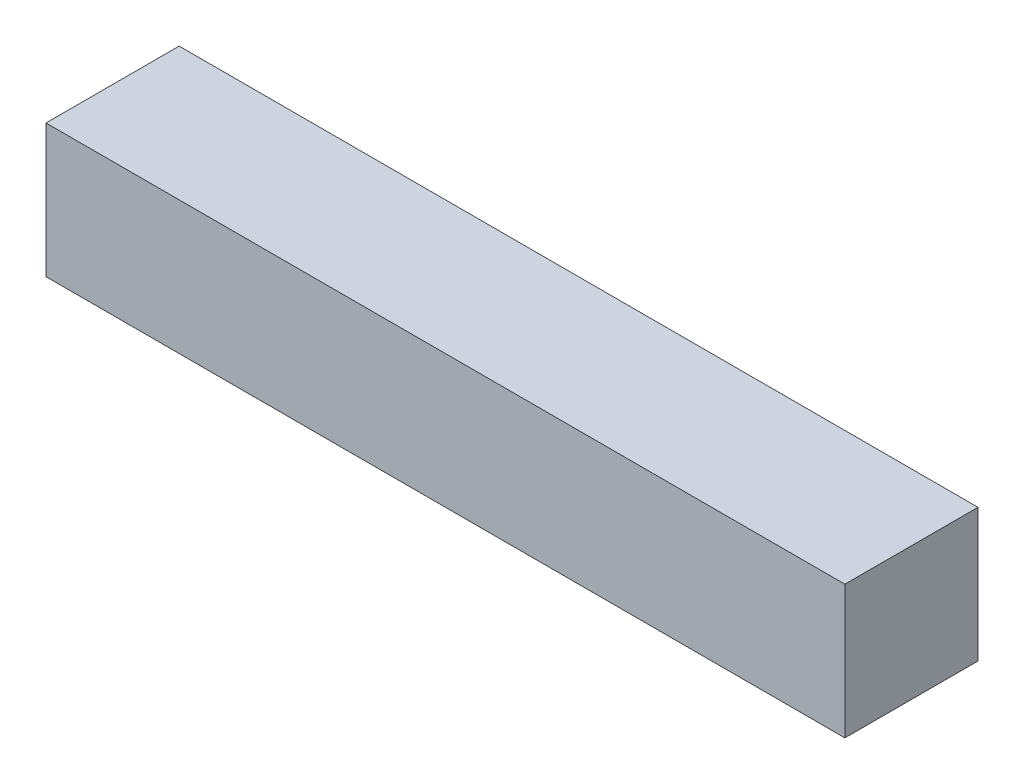
ISO-10303-21;
HEADER;
FILE_DESCRIPTION(('STEP AP214'),'2;1');
FILE_NAME('part.step','',(''),(''),'','','');
FILE_SCHEMA(('AUTOMOTIVE_DESIGN { 1 0 10303 214 1 1 1 1 }'));
ENDSEC;
DATA;
#1=APPLICATION_CONTEXT('core data for automotive mechanical design processes');
#2=APPLICATION_PROTOCOL_DEFINITION('international standard','automotive_design',2000,#1);
#3=PRODUCT_CONTEXT('',#1,'mechanical');
#4=PRODUCT('Part','Part','',(#3));
#5=PRODUCT_RELATED_PRODUCT_CATEGORY('part','',(#4));
#6=PRODUCT_DEFINITION_FORMATION('','',#4);
#7=PRODUCT_DEFINITION_CONTEXT('part definition',#1,'design');
#8=PRODUCT_DEFINITION('design','',#6,#7);
#9=PRODUCT_DEFINITION_SHAPE('','',#8);
#10=(LENGTH_UNIT() NAMED_UNIT(*) SI_UNIT(.MILLI.,.METRE.));
#11=(NAMED_UNIT(*) PLANE_ANGLE_UNIT() SI_UNIT($,.RADIAN.));
#12=(NAMED_UNIT(*) SI_UNIT($,.STERADIAN.) SOLID_ANGLE_UNIT());
#13=UNCERTAINTY_MEASURE_WITH_UNIT(LENGTH_MEASURE(1.E-05),#10,'distance_accuracy_value','');
#14=(GEOMETRIC_REPRESENTATION_CONTEXT(3) GLOBAL_UNCERTAINTY_ASSIGNED_CONTEXT((#13)) GLOBAL_UNIT_ASSIGNED_CONTEXT((#10,
#11,#12)) REPRESENTATION_CONTEXT('',''));
#15=CARTESIAN_POINT('',(0.,0.,0.));
#16=DIRECTION('',(0.,0.,1.));
#17=DIRECTION('',(1.,0.,0.));
#18=AXIS2_PLACEMENT_3D('',#15,#16,#17);
#19=CARTESIAN_POINT('',(19.05,-3.175,6.35));
#20=DIRECTION('',(-1.,0.,0.));
#21=DIRECTION('',(0.,0.,1.));
#22=AXIS2_PLACEMENT_3D('',#19,#20,#21);
#23=PLANE('',#22);
#24=DIRECTION('',(0.,1.,0.));
#25=VECTOR('',#24,1.);
#26=CARTESIAN_POINT('',(19.05,-3.175,0.));
#27=LINE('',#26,#25);
#28=CARTESIAN_POINT('',(19.05,-3.175,0.));
#29=VERTEX_POINT('',#28);
#30=CARTESIAN_POINT('',(19.05,3.175,0.));
#31=VERTEX_POINT('',#30);
#32=EDGE_CURVE('E96',#29,#31,#27,.T.);
#33=ORIENTED_EDGE('',*,*,#32,.T.);
#34=DIRECTION('',(0.,0.,-1.));
#35=VECTOR('',#34,1.);
#36=CARTESIAN_POINT('',(19.05,3.175,6.35));
#37=LINE('',#36,#35);
#38=CARTESIAN_POINT('',(19.05,3.175,6.35));
#39=VERTEX_POINT('',#38);
#40=EDGE_CURVE('E11',#39,#31,#37,.T.);
#41=ORIENTED_EDGE('',*,*,#40,.F.);
#42=DIRECTION('',(0.,1.,0.));
#43=VECTOR('',#42,1.);
#44=CARTESIAN_POINT('',(19.05,-3.175,6.35));
#45=LINE('',#44,#43);
#46=CARTESIAN_POINT('',(19.05,-3.175,6.35));
#47=VERTEX_POINT('',#46);
#48=EDGE_CURVE('E84',#47,#39,#45,.T.);
#49=ORIENTED_EDGE('',*,*,#48,.F.);
#50=DIRECTION('',(0.,0.,-1.));
#51=VECTOR('',#50,1.);
#52=CARTESIAN_POINT('',(19.05,-3.175,6.35));
#53=LINE('',#52,#51);
#54=EDGE_CURVE('E92',#47,#29,#53,.T.);
#55=ORIENTED_EDGE('',*,*,#54,.T.);
#56=EDGE_LOOP('',(#33,#41,#49,#55));
#57=FACE_BOUND('',#56,.T.);
#58=ADVANCED_FACE('F33',(#57),#23,.F.);
#59=CARTESIAN_POINT('',(-19.05,3.175,6.35));
#60=DIRECTION('',(0.,-1.,0.));
#61=DIRECTION('',(0.,0.,-1.));
#62=AXIS2_PLACEMENT_3D('',#59,#60,#61);
#63=PLANE('',#62);
#64=DIRECTION('',(-1.,0.,0.));
#65=VECTOR('',#64,1.);
#66=CARTESIAN_POINT('',(-19.05,3.175,0.));
#67=LINE('',#66,#65);
#68=CARTESIAN_POINT('',(-19.05,3.175,0.));
#69=VERTEX_POINT('',#68);
#70=EDGE_CURVE('E88',#31,#69,#67,.T.);
#71=ORIENTED_EDGE('',*,*,#70,.T.);
#72=DIRECTION('',(0.,0.,-1.));
#73=VECTOR('',#72,1.);
#74=CARTESIAN_POINT('',(-19.05,3.175,6.35));
#75=LINE('',#74,#73);
#76=CARTESIAN_POINT('',(-19.05,3.175,6.35));
#77=VERTEX_POINT('',#76);
#78=EDGE_CURVE('E41',#77,#69,#75,.T.);
#79=ORIENTED_EDGE('',*,*,#78,.F.);
#80=DIRECTION('',(-1.,0.,0.));
#81=VECTOR('',#80,1.);
#82=CARTESIAN_POINT('',(-19.05,3.175,6.35));
#83=LINE('',#82,#81);
#84=EDGE_CURVE('E79',#39,#77,#83,.T.);
#85=ORIENTED_EDGE('',*,*,#84,.F.);
#86=ORIENTED_EDGE('',*,*,#40,.T.);
#87=EDGE_LOOP('',(#71,#79,#85,#86));
#88=FACE_BOUND('',#87,.T.);
#89=ADVANCED_FACE('F87',(#88),#63,.F.);
#90=CARTESIAN_POINT('',(-19.05,-3.175,6.35));
#91=DIRECTION('',(1.,0.,0.));
#92=DIRECTION('',(0.,0.,-1.));
#93=AXIS2_PLACEMENT_3D('',#90,#91,#92);
#94=PLANE('',#93);
#95=DIRECTION('',(0.,-1.,0.));
#96=VECTOR('',#95,1.);
#97=CARTESIAN_POINT('',(-19.05,-3.175,0.));
#98=LINE('',#97,#96);
#99=CARTESIAN_POINT('',(-19.05,-3.175,0.));
#100=VERTEX_POINT('',#99);
#101=EDGE_CURVE('E66',#69,#100,#98,.T.);
#102=ORIENTED_EDGE('',*,*,#101,.T.);
#103=DIRECTION('',(0.,0.,-1.));
#104=VECTOR('',#103,1.);
#105=CARTESIAN_POINT('',(-19.05,-3.175,6.35));
#106=LINE('',#105,#104);
#107=CARTESIAN_POINT('',(-19.05,-3.175,6.35));
#108=VERTEX_POINT('',#107);
#109=EDGE_CURVE('E89',#108,#100,#106,.T.);
#110=ORIENTED_EDGE('',*,*,#109,.F.);
#111=DIRECTION('',(0.,-1.,0.));
#112=VECTOR('',#111,1.);
#113=CARTESIAN_POINT('',(-19.05,-3.175,6.35));
#114=LINE('',#113,#112);
#115=EDGE_CURVE('E82',#77,#108,#114,.T.);
#116=ORIENTED_EDGE('',*,*,#115,.F.);
#117=ORIENTED_EDGE('',*,*,#78,.T.);
#118=EDGE_LOOP('',(#102,#110,#116,#117));
#119=FACE_BOUND('',#118,.T.);
#120=ADVANCED_FACE('F90',(#119),#94,.F.);
#121=CARTESIAN_POINT('',(-19.05,-3.175,6.35));
#122=DIRECTION('',(0.,1.,0.));
#123=DIRECTION('',(0.,0.,1.));
#124=AXIS2_PLACEMENT_3D('',#121,#122,#123);
#125=PLANE('',#124);
#126=DIRECTION('',(1.,0.,0.));
#127=VECTOR('',#126,1.);
#128=CARTESIAN_POINT('',(-19.05,-3.175,0.));
#129=LINE('',#128,#127);
#130=EDGE_CURVE('E72',#100,#29,#129,.T.);
#131=ORIENTED_EDGE('',*,*,#130,.T.);
#132=ORIENTED_EDGE('',*,*,#54,.F.);
#133=DIRECTION('',(1.,0.,0.));
#134=VECTOR('',#133,1.);
#135=CARTESIAN_POINT('',(-19.05,-3.175,6.35));
#136=LINE('',#135,#134);
#137=EDGE_CURVE('E49',#108,#47,#136,.T.);
#138=ORIENTED_EDGE('',*,*,#137,.F.);
#139=ORIENTED_EDGE('',*,*,#109,.T.);
#140=EDGE_LOOP('',(#131,#132,#138,#139));
#141=FACE_BOUND('',#140,.T.);
#142=ADVANCED_FACE('F103',(#141),#125,.F.);
#143=CARTESIAN_POINT('',(19.05,3.175,6.35));
#144=DIRECTION('',(0.,0.,-1.));
#145=DIRECTION('',(-1.,0.,0.));
#146=AXIS2_PLACEMENT_3D('',#143,#144,#145);
#147=PLANE('',#146);
#148=ORIENTED_EDGE('',*,*,#48,.T.);
#149=ORIENTED_EDGE('',*,*,#84,.T.);
#150=ORIENTED_EDGE('',*,*,#115,.T.);
#151=ORIENTED_EDGE('',*,*,#137,.T.);
#152=EDGE_LOOP('',(#148,#149,#150,#151));
#153=FACE_BOUND('',#152,.T.);
#154=ADVANCED_FACE('F80',(#153),#147,.F.);
#155=CARTESIAN_POINT('',(19.05,3.175,0.));
#156=DIRECTION('',(0.,0.,-1.));
#157=DIRECTION('',(-1.,0.,0.));
#158=AXIS2_PLACEMENT_3D('',#155,#156,#157);
#159=PLANE('',#158);
#160=ORIENTED_EDGE('',*,*,#32,.F.);
#161=ORIENTED_EDGE('',*,*,#130,.F.);
#162=ORIENTED_EDGE('',*,*,#101,.F.);
#163=ORIENTED_EDGE('',*,*,#70,.F.);
#164=EDGE_LOOP('',(#160,#161,#162,#163));
#165=FACE_BOUND('',#164,.T.);
#166=ADVANCED_FACE('F106',(#165),#159,.T.);
#167=CLOSED_SHELL('',(#58,#89,#120,#142,#154,#166));
#168=MANIFOLD_SOLID_BREP('B2',#167);
#169=ADVANCED_BREP_SHAPE_REPRESENTATION('',(#18,#168),#14);
#170=SHAPE_DEFINITION_REPRESENTATION(#9,#169);
ENDSEC;
END-ISO-10303-21;
